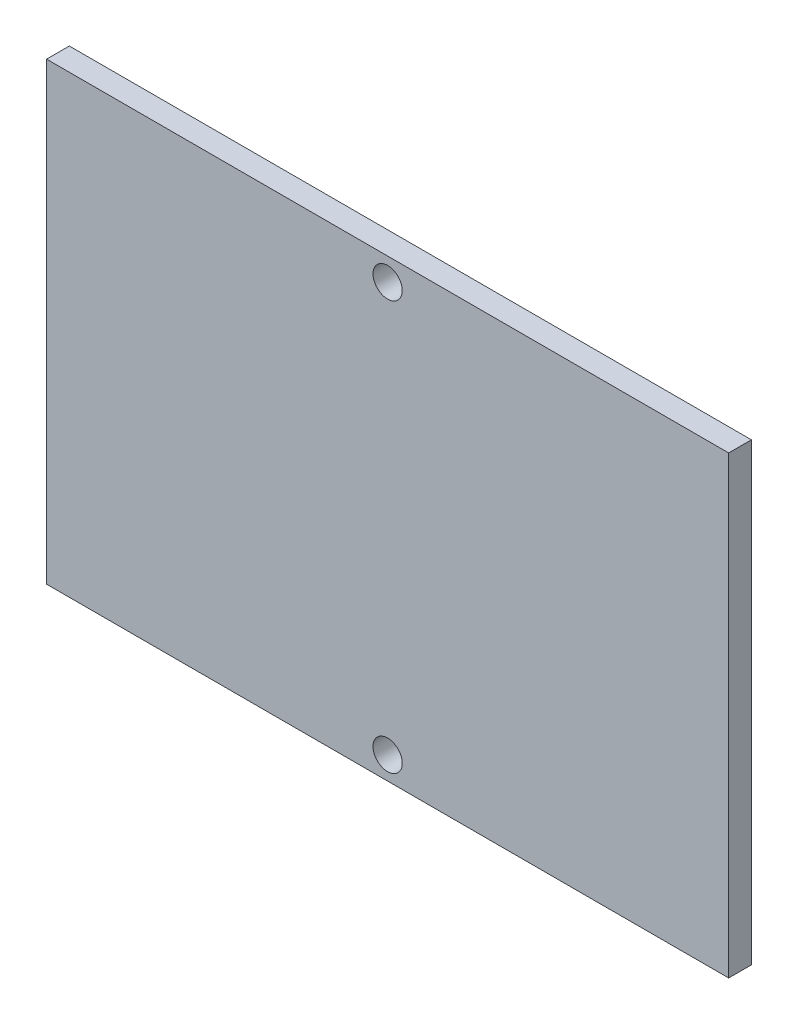
ISO-10303-21;
HEADER;
FILE_DESCRIPTION(('STEP AP214'),'2;1');
FILE_NAME('part.step','',(''),(''),'','','');
FILE_SCHEMA(('AUTOMOTIVE_DESIGN { 1 0 10303 214 1 1 1 1 }'));
ENDSEC;
DATA;
#1=APPLICATION_CONTEXT('core data for automotive mechanical design processes');
#2=APPLICATION_PROTOCOL_DEFINITION('international standard','automotive_design',2000,#1);
#3=PRODUCT_CONTEXT('',#1,'mechanical');
#4=PRODUCT('Part','Part','',(#3));
#5=PRODUCT_RELATED_PRODUCT_CATEGORY('part','',(#4));
#6=PRODUCT_DEFINITION_FORMATION('','',#4);
#7=PRODUCT_DEFINITION_CONTEXT('part definition',#1,'design');
#8=PRODUCT_DEFINITION('design','',#6,#7);
#9=PRODUCT_DEFINITION_SHAPE('','',#8);
#10=(LENGTH_UNIT() NAMED_UNIT(*) SI_UNIT(.MILLI.,.METRE.));
#11=(NAMED_UNIT(*) PLANE_ANGLE_UNIT() SI_UNIT($,.RADIAN.));
#12=(NAMED_UNIT(*) SI_UNIT($,.STERADIAN.) SOLID_ANGLE_UNIT());
#13=UNCERTAINTY_MEASURE_WITH_UNIT(LENGTH_MEASURE(1.E-05),#10,'distance_accuracy_value','');
#14=(GEOMETRIC_REPRESENTATION_CONTEXT(3) GLOBAL_UNCERTAINTY_ASSIGNED_CONTEXT((#13)) GLOBAL_UNIT_ASSIGNED_CONTEXT((#10,
#11,#12)) REPRESENTATION_CONTEXT('',''));
#15=CARTESIAN_POINT('',(0.,0.,0.));
#16=DIRECTION('',(0.,0.,1.));
#17=DIRECTION('',(1.,0.,0.));
#18=AXIS2_PLACEMENT_3D('',#15,#16,#17);
#19=CARTESIAN_POINT('',(-61.0576923076923,42.1908653846154,2.54));
#20=DIRECTION('',(1.,0.,0.));
#21=DIRECTION('',(0.,1.,0.));
#22=AXIS2_PLACEMENT_3D('',#19,#20,#21);
#23=PLANE('',#22);
#24=DIRECTION('',(0.,-1.,0.));
#25=VECTOR('',#24,1.);
#26=CARTESIAN_POINT('',(-61.0576923076923,42.1908653846154,0.));
#27=LINE('',#26,#25);
#28=CARTESIAN_POINT('',(-61.0576923076923,42.1908653846154,0.));
#29=VERTEX_POINT('',#28);
#30=CARTESIAN_POINT('',(-61.0576923076923,-8.60913461538462,0.));
#31=VERTEX_POINT('',#30);
#32=EDGE_CURVE('E114',#29,#31,#27,.T.);
#33=ORIENTED_EDGE('',*,*,#32,.T.);
#34=DIRECTION('',(0.,0.,-1.));
#35=VECTOR('',#34,1.);
#36=CARTESIAN_POINT('',(-61.0576923076923,-8.60913461538462,2.54));
#37=LINE('',#36,#35);
#38=CARTESIAN_POINT('',(-61.0576923076923,-8.60913461538462,2.54));
#39=VERTEX_POINT('',#38);
#40=EDGE_CURVE('E11',#39,#31,#37,.T.);
#41=ORIENTED_EDGE('',*,*,#40,.F.);
#42=DIRECTION('',(0.,-1.,0.));
#43=VECTOR('',#42,1.);
#44=CARTESIAN_POINT('',(-61.0576923076923,42.1908653846154,2.54));
#45=LINE('',#44,#43);
#46=CARTESIAN_POINT('',(-61.0576923076923,42.1908653846154,2.54));
#47=VERTEX_POINT('',#46);
#48=EDGE_CURVE('E92',#47,#39,#45,.T.);
#49=ORIENTED_EDGE('',*,*,#48,.F.);
#50=DIRECTION('',(0.,0.,-1.));
#51=VECTOR('',#50,1.);
#52=CARTESIAN_POINT('',(-61.0576923076923,42.1908653846154,2.54));
#53=LINE('',#52,#51);
#54=EDGE_CURVE('E65',#47,#29,#53,.T.);
#55=ORIENTED_EDGE('',*,*,#54,.T.);
#56=EDGE_LOOP('',(#33,#41,#49,#55));
#57=FACE_BOUND('',#56,.T.);
#58=ADVANCED_FACE('F44',(#57),#23,.F.);
#59=CARTESIAN_POINT('',(-61.0576923076923,-8.60913461538462,2.54));
#60=DIRECTION('',(0.,1.,0.));
#61=DIRECTION('',(0.,0.,1.));
#62=AXIS2_PLACEMENT_3D('',#59,#60,#61);
#63=PLANE('',#62);
#64=DIRECTION('',(1.,0.,0.));
#65=VECTOR('',#64,1.);
#66=CARTESIAN_POINT('',(-61.0576923076923,-8.60913461538462,0.));
#67=LINE('',#66,#65);
#68=CARTESIAN_POINT('',(15.1423076923077,-8.60913461538462,0.));
#69=VERTEX_POINT('',#68);
#70=EDGE_CURVE('E101',#31,#69,#67,.T.);
#71=ORIENTED_EDGE('',*,*,#70,.T.);
#72=DIRECTION('',(0.,0.,-1.));
#73=VECTOR('',#72,1.);
#74=CARTESIAN_POINT('',(15.1423076923077,-8.60913461538462,2.54));
#75=LINE('',#74,#73);
#76=CARTESIAN_POINT('',(15.1423076923077,-8.60913461538462,2.54));
#77=VERTEX_POINT('',#76);
#78=EDGE_CURVE('E53',#77,#69,#75,.T.);
#79=ORIENTED_EDGE('',*,*,#78,.F.);
#80=DIRECTION('',(1.,0.,0.));
#81=VECTOR('',#80,1.);
#82=CARTESIAN_POINT('',(-61.0576923076923,-8.60913461538462,2.54));
#83=LINE('',#82,#81);
#84=EDGE_CURVE('E87',#39,#77,#83,.T.);
#85=ORIENTED_EDGE('',*,*,#84,.F.);
#86=ORIENTED_EDGE('',*,*,#40,.T.);
#87=EDGE_LOOP('',(#71,#79,#85,#86));
#88=FACE_BOUND('',#87,.T.);
#89=ADVANCED_FACE('F99',(#88),#63,.F.);
#90=CARTESIAN_POINT('',(15.1423076923077,42.1908653846154,2.54));
#91=DIRECTION('',(1.,0.,0.));
#92=DIRECTION('',(0.,1.,0.));
#93=AXIS2_PLACEMENT_3D('',#90,#91,#92);
#94=PLANE('',#93);
#95=DIRECTION('',(0.,-1.,0.));
#96=VECTOR('',#95,1.);
#97=CARTESIAN_POINT('',(15.1423076923077,42.1908653846154,0.));
#98=LINE('',#97,#96);
#99=CARTESIAN_POINT('',(15.1423076923077,42.1908653846154,0.));
#100=VERTEX_POINT('',#99);
#101=EDGE_CURVE('E116',#100,#69,#98,.T.);
#102=ORIENTED_EDGE('',*,*,#101,.F.);
#103=DIRECTION('',(0.,0.,-1.));
#104=VECTOR('',#103,1.);
#105=CARTESIAN_POINT('',(15.1423076923077,42.1908653846154,2.54));
#106=LINE('',#105,#104);
#107=CARTESIAN_POINT('',(15.1423076923077,42.1908653846154,2.54));
#108=VERTEX_POINT('',#107);
#109=EDGE_CURVE('E77',#108,#100,#106,.T.);
#110=ORIENTED_EDGE('',*,*,#109,.F.);
#111=DIRECTION('',(0.,-1.,0.));
#112=VECTOR('',#111,1.);
#113=CARTESIAN_POINT('',(15.1423076923077,42.1908653846154,2.54));
#114=LINE('',#113,#112);
#115=EDGE_CURVE('E94',#108,#77,#114,.T.);
#116=ORIENTED_EDGE('',*,*,#115,.T.);
#117=ORIENTED_EDGE('',*,*,#78,.T.);
#118=EDGE_LOOP('',(#102,#110,#116,#117));
#119=FACE_BOUND('',#118,.T.);
#120=ADVANCED_FACE('F104',(#119),#94,.T.);
#121=CARTESIAN_POINT('',(-61.0576923076923,42.1908653846154,2.54));
#122=DIRECTION('',(0.,1.,0.));
#123=DIRECTION('',(0.,0.,1.));
#124=AXIS2_PLACEMENT_3D('',#121,#122,#123);
#125=PLANE('',#124);
#126=DIRECTION('',(1.,0.,0.));
#127=VECTOR('',#126,1.);
#128=CARTESIAN_POINT('',(-61.0576923076923,42.1908653846154,0.));
#129=LINE('',#128,#127);
#130=EDGE_CURVE('E125',#29,#100,#129,.T.);
#131=ORIENTED_EDGE('',*,*,#130,.F.);
#132=ORIENTED_EDGE('',*,*,#54,.F.);
#133=DIRECTION('',(1.,0.,0.));
#134=VECTOR('',#133,1.);
#135=CARTESIAN_POINT('',(-61.0576923076923,42.1908653846154,2.54));
#136=LINE('',#135,#134);
#137=EDGE_CURVE('E110',#47,#108,#136,.T.);
#138=ORIENTED_EDGE('',*,*,#137,.T.);
#139=ORIENTED_EDGE('',*,*,#109,.T.);
#140=EDGE_LOOP('',(#131,#132,#138,#139));
#141=FACE_BOUND('',#140,.T.);
#142=ADVANCED_FACE('F159',(#141),#125,.T.);
#143=CARTESIAN_POINT('',(0.,0.,2.54));
#144=DIRECTION('',(0.,0.,1.));
#145=DIRECTION('',(1.,0.,0.));
#146=AXIS2_PLACEMENT_3D('',#143,#144,#145);
#147=PLANE('',#146);
#148=CARTESIAN_POINT('',(-22.9576923076923,-6.06913461538462,2.54));
#149=DIRECTION('',(0.,0.,1.));
#150=DIRECTION('',(1.,0.,0.));
#151=AXIS2_PLACEMENT_3D('',#148,#149,#150);
#152=CIRCLE('',#151,1.63098546743029);
#153=CARTESIAN_POINT('',(-21.326706840262,-6.06913461538462,2.54));
#154=VERTEX_POINT('',#153);
#155=EDGE_CURVE('E137',#154,#154,#152,.T.);
#156=ORIENTED_EDGE('',*,*,#155,.F.);
#157=EDGE_LOOP('',(#156));
#158=FACE_BOUND('',#157,.T.);
#159=CARTESIAN_POINT('',(-22.9576923076923,39.6508653846154,2.54));
#160=DIRECTION('',(0.,0.,1.));
#161=DIRECTION('',(1.,0.,0.));
#162=AXIS2_PLACEMENT_3D('',#159,#160,#161);
#163=CIRCLE('',#162,1.63098546743029);
#164=CARTESIAN_POINT('',(-21.326706840262,39.6508653846154,2.54));
#165=VERTEX_POINT('',#164);
#166=EDGE_CURVE('E135',#165,#165,#163,.T.);
#167=ORIENTED_EDGE('',*,*,#166,.F.);
#168=EDGE_LOOP('',(#167));
#169=FACE_BOUND('',#168,.T.);
#170=ORIENTED_EDGE('',*,*,#48,.T.);
#171=ORIENTED_EDGE('',*,*,#84,.T.);
#172=ORIENTED_EDGE('',*,*,#115,.F.);
#173=ORIENTED_EDGE('',*,*,#137,.F.);
#174=EDGE_LOOP('',(#170,#171,#172,#173));
#175=FACE_BOUND('',#174,.T.);
#176=ADVANCED_FACE('F93',(#158,#169,#175),#147,.T.);
#177=CARTESIAN_POINT('',(0.,0.,0.));
#178=DIRECTION('',(0.,0.,1.));
#179=DIRECTION('',(1.,0.,0.));
#180=AXIS2_PLACEMENT_3D('',#177,#178,#179);
#181=PLANE('',#180);
#182=CARTESIAN_POINT('',(-22.9576923076923,-6.06913461538462,0.));
#183=DIRECTION('',(0.,0.,1.));
#184=DIRECTION('',(1.,0.,0.));
#185=AXIS2_PLACEMENT_3D('',#182,#183,#184);
#186=CIRCLE('',#185,1.63098546743029);
#187=CARTESIAN_POINT('',(-21.326706840262,-6.06913461538462,0.));
#188=VERTEX_POINT('',#187);
#189=EDGE_CURVE('E138',#188,#188,#186,.T.);
#190=ORIENTED_EDGE('',*,*,#189,.T.);
#191=EDGE_LOOP('',(#190));
#192=FACE_BOUND('',#191,.T.);
#193=CARTESIAN_POINT('',(-22.9576923076923,39.6508653846154,0.));
#194=DIRECTION('',(0.,0.,1.));
#195=DIRECTION('',(1.,0.,0.));
#196=AXIS2_PLACEMENT_3D('',#193,#194,#195);
#197=CIRCLE('',#196,1.63098546743029);
#198=CARTESIAN_POINT('',(-21.326706840262,39.6508653846154,0.));
#199=VERTEX_POINT('',#198);
#200=EDGE_CURVE('E117',#199,#199,#197,.T.);
#201=ORIENTED_EDGE('',*,*,#200,.T.);
#202=EDGE_LOOP('',(#201));
#203=FACE_BOUND('',#202,.T.);
#204=ORIENTED_EDGE('',*,*,#32,.F.);
#205=ORIENTED_EDGE('',*,*,#130,.T.);
#206=ORIENTED_EDGE('',*,*,#101,.T.);
#207=ORIENTED_EDGE('',*,*,#70,.F.);
#208=EDGE_LOOP('',(#204,#205,#206,#207));
#209=FACE_BOUND('',#208,.T.);
#210=ADVANCED_FACE('F146',(#192,#203,#209),#181,.F.);
#211=CARTESIAN_POINT('',(-22.9576923076923,39.6508653846154,0.));
#212=DIRECTION('',(0.,0.,1.));
#213=DIRECTION('',(1.,0.,0.));
#214=AXIS2_PLACEMENT_3D('',#211,#212,#213);
#215=CYLINDRICAL_SURFACE('',#214,1.63098546743029);
#216=ORIENTED_EDGE('',*,*,#200,.F.);
#217=EDGE_LOOP('',(#216));
#218=FACE_BOUND('',#217,.T.);
#219=ORIENTED_EDGE('',*,*,#166,.T.);
#220=EDGE_LOOP('',(#219));
#221=FACE_BOUND('',#220,.T.);
#222=ADVANCED_FACE('F152',(#218,#221),#215,.F.);
#223=CARTESIAN_POINT('',(-22.9576923076923,-6.06913461538462,0.));
#224=DIRECTION('',(0.,0.,1.));
#225=DIRECTION('',(1.,0.,0.));
#226=AXIS2_PLACEMENT_3D('',#223,#224,#225);
#227=CYLINDRICAL_SURFACE('',#226,1.63098546743029);
#228=ORIENTED_EDGE('',*,*,#189,.F.);
#229=EDGE_LOOP('',(#228));
#230=FACE_BOUND('',#229,.T.);
#231=ORIENTED_EDGE('',*,*,#155,.T.);
#232=EDGE_LOOP('',(#231));
#233=FACE_BOUND('',#232,.T.);
#234=ADVANCED_FACE('F151',(#230,#233),#227,.F.);
#235=CLOSED_SHELL('',(#58,#89,#120,#142,#176,#210,#222,#234));
#236=MANIFOLD_SOLID_BREP('B2',#235);
#237=ADVANCED_BREP_SHAPE_REPRESENTATION('',(#18,#236),#14);
#238=SHAPE_DEFINITION_REPRESENTATION(#9,#237);
ENDSEC;
END-ISO-10303-21;
